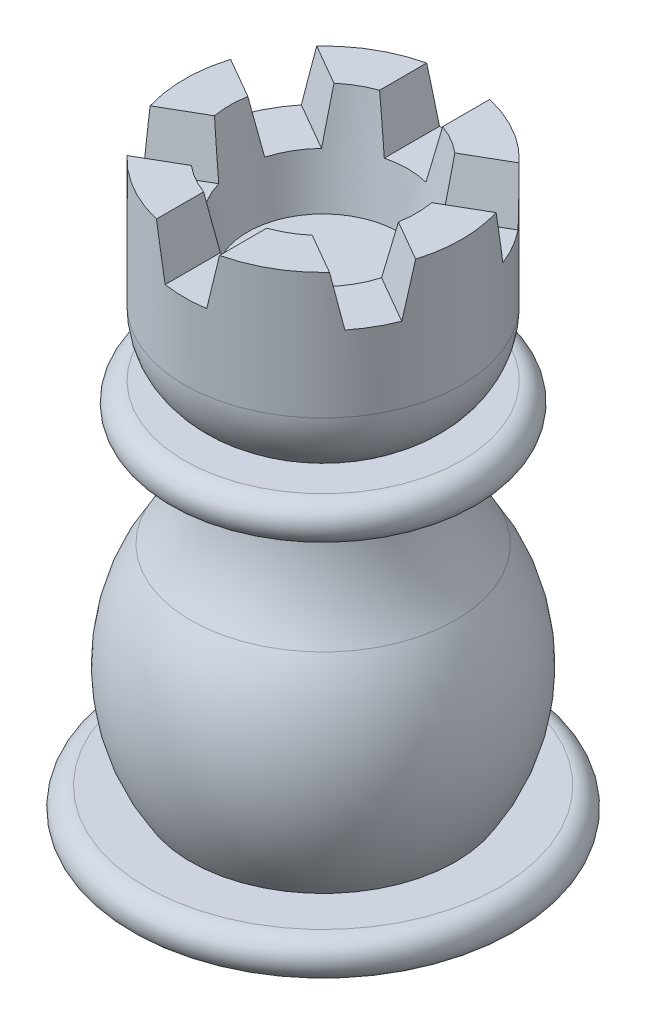
ISO-10303-21;
HEADER;
FILE_DESCRIPTION(('STEP AP214'),'2;1');
FILE_NAME('part.step','',(''),(''),'','','');
FILE_SCHEMA(('AUTOMOTIVE_DESIGN { 1 0 10303 214 1 1 1 1 }'));
ENDSEC;
DATA;
#1=APPLICATION_CONTEXT('core data for automotive mechanical design processes');
#2=APPLICATION_PROTOCOL_DEFINITION('international standard','automotive_design',2000,#1);
#3=PRODUCT_CONTEXT('',#1,'mechanical');
#4=PRODUCT('Part','Part','',(#3));
#5=PRODUCT_RELATED_PRODUCT_CATEGORY('part','',(#4));
#6=PRODUCT_DEFINITION_FORMATION('','',#4);
#7=PRODUCT_DEFINITION_CONTEXT('part definition',#1,'design');
#8=PRODUCT_DEFINITION('design','',#6,#7);
#9=PRODUCT_DEFINITION_SHAPE('','',#8);
#10=(LENGTH_UNIT() NAMED_UNIT(*) SI_UNIT(.MILLI.,.METRE.));
#11=(NAMED_UNIT(*) PLANE_ANGLE_UNIT() SI_UNIT($,.RADIAN.));
#12=(NAMED_UNIT(*) SI_UNIT($,.STERADIAN.) SOLID_ANGLE_UNIT());
#13=UNCERTAINTY_MEASURE_WITH_UNIT(LENGTH_MEASURE(1.E-05),#10,'distance_accuracy_value','');
#14=(GEOMETRIC_REPRESENTATION_CONTEXT(3) GLOBAL_UNCERTAINTY_ASSIGNED_CONTEXT((#13)) GLOBAL_UNIT_ASSIGNED_CONTEXT((#10,
#11,#12)) REPRESENTATION_CONTEXT('',''));
#15=CARTESIAN_POINT('',(0.,0.,0.));
#16=DIRECTION('',(0.,0.,1.));
#17=DIRECTION('',(1.,0.,0.));
#18=AXIS2_PLACEMENT_3D('',#15,#16,#17);
#19=CARTESIAN_POINT('',(0.,0.,0.));
#20=DIRECTION('',(0.,-1.,0.));
#21=DIRECTION('',(1.,0.,0.));
#22=AXIS2_PLACEMENT_3D('',#19,#20,#21);
#23=CYLINDRICAL_SURFACE('',#22,11.0000000000001);
#24=CARTESIAN_POINT('',(-1.23488963959887E-13,36.,0.));
#25=DIRECTION('',(0.,-1.,0.));
#26=DIRECTION('',(1.,0.,0.));
#27=AXIS2_PLACEMENT_3D('',#24,#25,#26);
#28=CIRCLE('',#27,11.0000000000001);
#29=CARTESIAN_POINT('',(11.,36.,0.));
#30=VERTEX_POINT('',#29);
#31=EDGE_CURVE('E248',#30,#30,#28,.T.);
#32=ORIENTED_EDGE('',*,*,#31,.F.);
#33=EDGE_LOOP('',(#32));
#34=FACE_BOUND('',#33,.T.);
#35=CARTESIAN_POINT('',(-1.44070457953202E-13,42.,0.));
#36=DIRECTION('',(0.,1.,0.));
#37=DIRECTION('',(-1.,0.,0.));
#38=AXIS2_PLACEMENT_3D('',#35,#36,#37);
#39=CIRCLE('',#38,11.0000000000001);
#40=CARTESIAN_POINT('',(8.59364193213736,42.,-6.86653612400103));
#41=VERTEX_POINT('',#40);
#42=CARTESIAN_POINT('',(10.2434156854572,42.,-4.00904416225737));
#43=VERTEX_POINT('',#42);
#44=EDGE_CURVE('E518',#41,#43,#39,.F.);
#45=ORIENTED_EDGE('',*,*,#44,.T.);
#46=CARTESIAN_POINT('',(-1.17446322140828E-13,34.2384247263033,0.));
#47=DIRECTION('',(-0.489073800366901,0.207911690817761,-0.847100670886274));
#48=DIRECTION('',(-0.103955845408878,-0.978147600733805,-0.180056805991959));
#49=AXIS2_PLACEMENT_3D('',#46,#47,#48);
#50=ELLIPSE('',#49,52.9070777921852,11.0000000000001);
#51=CARTESIAN_POINT('',(10.5269876576398,46.,-3.19100781194594));
#52=VERTEX_POINT('',#51);
#53=EDGE_CURVE('E443',#43,#52,#50,.F.);
#54=ORIENTED_EDGE('',*,*,#53,.T.);
#55=CARTESIAN_POINT('',(-1.57791453948745E-13,46.,0.));
#56=DIRECTION('',(0.,-1.,0.));
#57=DIRECTION('',(1.,0.,0.));
#58=AXIS2_PLACEMENT_3D('',#55,#56,#57);
#59=CIRCLE('',#58,11.0000000000002);
#60=CARTESIAN_POINT('',(10.5269876576396,46.,3.19100781194637));
#61=VERTEX_POINT('',#60);
#62=EDGE_CURVE('E249',#52,#61,#59,.T.);
#63=ORIENTED_EDGE('',*,*,#62,.T.);
#64=CARTESIAN_POINT('',(-1.17446322140833E-13,34.238424726305,0.));
#65=DIRECTION('',(0.489073800366907,-0.207911690817761,-0.847100670886271));
#66=DIRECTION('',(-0.103955845408879,-0.978147600733805,0.180056805991958));
#67=AXIS2_PLACEMENT_3D('',#64,#65,#66);
#68=ELLIPSE('',#67,52.9070777921852,11.0000000000001);
#69=CARTESIAN_POINT('',(10.243415685457,42.,4.00904416225778));
#70=VERTEX_POINT('',#69);
#71=EDGE_CURVE('E433',#70,#61,#68,.F.);
#72=ORIENTED_EDGE('',*,*,#71,.F.);
#73=CARTESIAN_POINT('',(8.59364193213709,42.,6.86653612400137));
#74=VERTEX_POINT('',#73);
#75=EDGE_CURVE('E515',#70,#74,#39,.F.);
#76=ORIENTED_EDGE('',*,*,#75,.T.);
#77=CARTESIAN_POINT('',(-1.17446322140828E-13,34.2384247263033,0.));
#78=DIRECTION('',(0.489073800366906,0.207911690817765,-0.847100670886271));
#79=DIRECTION('',(0.103955845408886,-0.978147600733805,-0.180056805991958));
#80=AXIS2_PLACEMENT_3D('',#77,#78,#79);
#81=ELLIPSE('',#80,52.9070777921851,11.0000000000001);
#82=CARTESIAN_POINT('',(8.02698765763957,46.,7.52113483086847));
#83=VERTEX_POINT('',#82);
#84=EDGE_CURVE('E429',#74,#83,#81,.F.);
#85=ORIENTED_EDGE('',*,*,#84,.T.);
#86=CARTESIAN_POINT('',(2.49999999999964,46.,10.7121426428145));
#87=VERTEX_POINT('',#86);
#88=EDGE_CURVE('E241',#83,#87,#59,.T.);
#89=ORIENTED_EDGE('',*,*,#88,.T.);
#90=CARTESIAN_POINT('',(-1.17446322140833E-13,34.238424726305,0.));
#91=DIRECTION('',(0.978147600733806,-0.207911690817759,0.));
#92=DIRECTION('',(-0.20791169081776,-0.978147600733806,0.));
#93=AXIS2_PLACEMENT_3D('',#90,#91,#92);
#94=ELLIPSE('',#93,52.9070777921852,11.0000000000001);
#95=CARTESIAN_POINT('',(1.64977375331955,42.,10.8755802862588));
#96=VERTEX_POINT('',#95);
#97=EDGE_CURVE('E423',#96,#87,#94,.F.);
#98=ORIENTED_EDGE('',*,*,#97,.F.);
#99=CARTESIAN_POINT('',(-1.6497737533202,42.,10.8755802862587));
#100=VERTEX_POINT('',#99);
#101=EDGE_CURVE('E441',#96,#100,#39,.F.);
#102=ORIENTED_EDGE('',*,*,#101,.T.);
#103=CARTESIAN_POINT('',(-1.17446322140828E-13,34.2384247263033,0.));
#104=DIRECTION('',(0.978147600733804,0.207911690817766,0.));
#105=DIRECTION('',(0.207911690817766,-0.978147600733804,0.));
#106=AXIS2_PLACEMENT_3D('',#103,#104,#105);
#107=ELLIPSE('',#106,52.9070777921852,11.0000000000001);
#108=CARTESIAN_POINT('',(-2.50000000000032,46.,10.7121426428144));
#109=VERTEX_POINT('',#108);
#110=EDGE_CURVE('E419',#100,#109,#107,.F.);
#111=ORIENTED_EDGE('',*,*,#110,.T.);
#112=CARTESIAN_POINT('',(-8.02698765764024,46.,7.52113483086809));
#113=VERTEX_POINT('',#112);
#114=EDGE_CURVE('E235',#109,#113,#59,.T.);
#115=ORIENTED_EDGE('',*,*,#114,.T.);
#116=CARTESIAN_POINT('',(-1.17446322140834E-13,34.238424726305,0.));
#117=DIRECTION('',(0.489073800366895,-0.207911690817761,0.847100670886278));
#118=DIRECTION('',(-0.103955845408876,-0.978147600733805,-0.180056805991959));
#119=AXIS2_PLACEMENT_3D('',#116,#117,#118);
#120=ELLIPSE('',#119,52.9070777921852,11.0000000000001);
#121=CARTESIAN_POINT('',(-8.5936419321377,42.,6.86653612400096));
#122=VERTEX_POINT('',#121);
#123=EDGE_CURVE('E416',#122,#113,#120,.F.);
#124=ORIENTED_EDGE('',*,*,#123,.F.);
#125=CARTESIAN_POINT('',(-10.2434156854575,42.,4.0090441622573));
#126=VERTEX_POINT('',#125);
#127=EDGE_CURVE('E360',#122,#126,#39,.F.);
#128=ORIENTED_EDGE('',*,*,#127,.T.);
#129=CARTESIAN_POINT('',(-1.17446322140828E-13,34.2384247263033,0.));
#130=DIRECTION('',(0.489073800366894,0.207911690817765,0.847100670886278));
#131=DIRECTION('',(0.103955845408883,-0.978147600733804,0.18005680599196));
#132=AXIS2_PLACEMENT_3D('',#129,#130,#131);
#133=ELLIPSE('',#132,52.9070777921852,11.0000000000001);
#134=CARTESIAN_POINT('',(-10.5269876576401,46.,3.19100781194587));
#135=VERTEX_POINT('',#134);
#136=EDGE_CURVE('E218',#126,#135,#133,.F.);
#137=ORIENTED_EDGE('',*,*,#136,.T.);
#138=CARTESIAN_POINT('',(-10.5269876576399,46.,-3.19100781194644));
#139=VERTEX_POINT('',#138);
#140=EDGE_CURVE('E226',#135,#139,#59,.T.);
#141=ORIENTED_EDGE('',*,*,#140,.T.);
#142=CARTESIAN_POINT('',(-1.17446322140833E-13,34.238424726305,0.));
#143=DIRECTION('',(-0.489073800366912,-0.207911690817765,0.847100670886268));
#144=DIRECTION('',(0.103955845408887,-0.978147600733805,-0.180056805991957));
#145=AXIS2_PLACEMENT_3D('',#142,#143,#144);
#146=ELLIPSE('',#145,52.9070777921852,11.0000000000001);
#147=CARTESIAN_POINT('',(-10.2434156854573,42.,-4.00904416225785));
#148=VERTEX_POINT('',#147);
#149=EDGE_CURVE('E207',#148,#139,#146,.F.);
#150=ORIENTED_EDGE('',*,*,#149,.F.);
#151=CARTESIAN_POINT('',(-8.5936419321376,42.,-6.86653612400108));
#152=VERTEX_POINT('',#151);
#153=EDGE_CURVE('E442',#148,#152,#39,.F.);
#154=ORIENTED_EDGE('',*,*,#153,.T.);
#155=CARTESIAN_POINT('',(-1.17446322140833E-13,34.238424726305,0.));
#156=DIRECTION('',(0.489073800366907,-0.207911690817761,-0.847100670886271));
#157=DIRECTION('',(-0.103955845408879,-0.978147600733805,0.180056805991958));
#158=AXIS2_PLACEMENT_3D('',#155,#156,#157);
#159=ELLIPSE('',#158,52.9070777921852,11.0000000000001);
#160=CARTESIAN_POINT('',(-8.02698765764014,46.,-7.5211348308682));
#161=VERTEX_POINT('',#160);
#162=EDGE_CURVE('E426',#161,#152,#159,.F.);
#163=ORIENTED_EDGE('',*,*,#162,.F.);
#164=CARTESIAN_POINT('',(-2.49999999999996,46.,-10.7121426428145));
#165=VERTEX_POINT('',#164);
#166=EDGE_CURVE('E236',#161,#165,#59,.T.);
#167=ORIENTED_EDGE('',*,*,#166,.T.);
#168=CARTESIAN_POINT('',(-1.17446322140833E-13,34.238424726305,0.));
#169=DIRECTION('',(-0.978147600733804,-0.207911690817766,0.));
#170=DIRECTION('',(0.207911690817766,-0.978147600733804,0.));
#171=AXIS2_PLACEMENT_3D('',#168,#169,#170);
#172=ELLIPSE('',#171,52.9070777921852,11.0000000000001);
#173=CARTESIAN_POINT('',(-1.64977375331984,42.,-10.8755802862588));
#174=VERTEX_POINT('',#173);
#175=EDGE_CURVE('E452',#174,#165,#172,.F.);
#176=ORIENTED_EDGE('',*,*,#175,.F.);
#177=CARTESIAN_POINT('',(-1.44070457953202E-13,42.,0.));
#178=DIRECTION('',(0.,1.,0.));
#179=DIRECTION('',(-1.,0.,0.));
#180=AXIS2_PLACEMENT_3D('',#177,#178,#179);
#181=CIRCLE('',#180,11.0000000000001);
#182=CARTESIAN_POINT('',(1.64977375331991,42.,-10.8755802862587));
#183=VERTEX_POINT('',#182);
#184=EDGE_CURVE('E467',#174,#183,#181,.F.);
#185=ORIENTED_EDGE('',*,*,#184,.T.);
#186=CARTESIAN_POINT('',(-1.17446322140828E-13,34.2384247263033,0.));
#187=DIRECTION('',(-0.978147600733806,0.20791169081776,0.));
#188=DIRECTION('',(-0.20791169081776,-0.978147600733806,0.));
#189=AXIS2_PLACEMENT_3D('',#186,#187,#188);
#190=ELLIPSE('',#189,52.9070777921852,11.0000000000001);
#191=CARTESIAN_POINT('',(2.5,46.,-10.7121426428144));
#192=VERTEX_POINT('',#191);
#193=EDGE_CURVE('E471',#183,#192,#190,.F.);
#194=ORIENTED_EDGE('',*,*,#193,.T.);
#195=CARTESIAN_POINT('',(8.02698765763987,46.,-7.52113483086814));
#196=VERTEX_POINT('',#195);
#197=EDGE_CURVE('E243',#192,#196,#59,.T.);
#198=ORIENTED_EDGE('',*,*,#197,.T.);
#199=CARTESIAN_POINT('',(-1.17446322140833E-13,34.238424726305,0.));
#200=DIRECTION('',(-0.4890738003669,-0.207911690817765,-0.847100670886274));
#201=DIRECTION('',(0.103955845408884,-0.978147600733805,0.180056805991959));
#202=AXIS2_PLACEMENT_3D('',#199,#200,#201);
#203=ELLIPSE('',#202,52.9070777921852,11.0000000000001);
#204=EDGE_CURVE('E436',#41,#196,#203,.F.);
#205=ORIENTED_EDGE('',*,*,#204,.F.);
#206=EDGE_LOOP('',(#45,#54,#63,#72,#76,#85,#89,#98,#102,#111,#115,#124,#128,#137,#141,#150,#154,
#163,#167,#176,#185,#194,#198,#205));
#207=FACE_BOUND('',#206,.T.);
#208=ADVANCED_FACE('F45',(#34,#207),#23,.T.);
#209=CARTESIAN_POINT('',(11.,46.,0.));
#210=DIRECTION('',(0.,1.,0.));
#211=DIRECTION('',(-1.,0.,0.));
#212=AXIS2_PLACEMENT_3D('',#209,#210,#211);
#213=PLANE('',#212);
#214=ORIENTED_EDGE('',*,*,#62,.F.);
#215=DIRECTION('',(-0.86602540378444,0.,0.499999999999998));
#216=VECTOR('',#215,1.);
#217=CARTESIAN_POINT('',(19.5866968793295,46.0000000000001,-8.42163336986818));
#218=LINE('',#217,#216);
#219=CARTESIAN_POINT('',(7.29155777999725,46.,-1.32303150114488));
#220=VERTEX_POINT('',#219);
#221=EDGE_CURVE('E219',#52,#220,#218,.T.);
#222=ORIENTED_EDGE('',*,*,#221,.T.);
#223=CARTESIAN_POINT('',(-1.57791453948745E-13,46.,0.));
#224=DIRECTION('',(0.,-1.,0.));
#225=DIRECTION('',(1.,0.,0.));
#226=AXIS2_PLACEMENT_3D('',#223,#224,#225);
#227=CIRCLE('',#226,7.41061584566782);
#228=CARTESIAN_POINT('',(7.29155777999726,46.,1.32303150114536));
#229=VERTEX_POINT('',#228);
#230=EDGE_CURVE('E489',#220,#229,#227,.T.);
#231=ORIENTED_EDGE('',*,*,#230,.T.);
#232=DIRECTION('',(-0.866025403784436,0.,-0.500000000000004));
#233=VECTOR('',#232,1.);
#234=CARTESIAN_POINT('',(19.5866968793292,46.0000000000001,8.42163336986865));
#235=LINE('',#234,#233);
#236=EDGE_CURVE('E399',#61,#229,#235,.T.);
#237=ORIENTED_EDGE('',*,*,#236,.F.);
#238=EDGE_LOOP('',(#214,#222,#231,#237));
#239=FACE_BOUND('',#238,.T.);
#240=ADVANCED_FACE('F569',(#239),#213,.T.);
#241=ORIENTED_EDGE('',*,*,#88,.F.);
#242=DIRECTION('',(-0.866025403784436,0.,-0.500000000000004));
#243=VECTOR('',#242,1.);
#244=CARTESIAN_POINT('',(17.0866968793292,46.,12.7517603887908));
#245=LINE('',#244,#243);
#246=CARTESIAN_POINT('',(4.79155777999712,46.,5.65315852006743));
#247=VERTEX_POINT('',#246);
#248=EDGE_CURVE('E387',#83,#247,#245,.T.);
#249=ORIENTED_EDGE('',*,*,#248,.T.);
#250=CARTESIAN_POINT('',(2.49999999999964,46.,6.97619002121243));
#251=VERTEX_POINT('',#250);
#252=EDGE_CURVE('E495',#247,#251,#227,.T.);
#253=ORIENTED_EDGE('',*,*,#252,.T.);
#254=DIRECTION('',(0.,0.,-1.));
#255=VECTOR('',#254,1.);
#256=CARTESIAN_POINT('',(2.49999999999964,46.,15.5));
#257=LINE('',#256,#255);
#258=EDGE_CURVE('E384',#87,#251,#257,.T.);
#259=ORIENTED_EDGE('',*,*,#258,.F.);
#260=EDGE_LOOP('',(#241,#249,#253,#259));
#261=FACE_BOUND('',#260,.T.);
#262=ADVANCED_FACE('F564',(#261),#213,.T.);
#263=ORIENTED_EDGE('',*,*,#114,.F.);
#264=DIRECTION('',(0.,0.,-1.));
#265=VECTOR('',#264,1.);
#266=CARTESIAN_POINT('',(-2.50000000000032,46.,15.5));
#267=LINE('',#266,#265);
#268=CARTESIAN_POINT('',(-2.50000000000032,46.,6.97619002121228));
#269=VERTEX_POINT('',#268);
#270=EDGE_CURVE('E373',#109,#269,#267,.T.);
#271=ORIENTED_EDGE('',*,*,#270,.T.);
#272=CARTESIAN_POINT('',(-4.79155777999773,46.,5.65315852006706));
#273=VERTEX_POINT('',#272);
#274=EDGE_CURVE('E486',#269,#273,#227,.T.);
#275=ORIENTED_EDGE('',*,*,#274,.T.);
#276=DIRECTION('',(0.866025403784443,0.,-0.499999999999992));
#277=VECTOR('',#276,1.);
#278=CARTESIAN_POINT('',(-17.0866968793297,45.9999999999999,12.7517603887901));
#279=LINE('',#278,#277);
#280=EDGE_CURVE('E364',#113,#273,#279,.T.);
#281=ORIENTED_EDGE('',*,*,#280,.F.);
#282=EDGE_LOOP('',(#263,#271,#275,#281));
#283=FACE_BOUND('',#282,.T.);
#284=ADVANCED_FACE('F507',(#283),#213,.T.);
#285=ORIENTED_EDGE('',*,*,#140,.F.);
#286=DIRECTION('',(0.866025403784443,0.,-0.499999999999992));
#287=VECTOR('',#286,1.);
#288=CARTESIAN_POINT('',(-19.5866968793297,45.9999999999999,8.42163336986796));
#289=LINE('',#288,#287);
#290=CARTESIAN_POINT('',(-7.29155777999758,46.,1.32303150114484));
#291=VERTEX_POINT('',#290);
#292=EDGE_CURVE('E368',#135,#291,#289,.T.);
#293=ORIENTED_EDGE('',*,*,#292,.T.);
#294=CARTESIAN_POINT('',(-7.29155777999751,45.9999999999999,-1.32303150114539));
#295=VERTEX_POINT('',#294);
#296=EDGE_CURVE('E228',#291,#295,#227,.T.);
#297=ORIENTED_EDGE('',*,*,#296,.T.);
#298=DIRECTION('',(0.866025403784433,0.,0.50000000000001));
#299=VECTOR('',#298,1.);
#300=CARTESIAN_POINT('',(-19.5866968793294,45.9999999999999,-8.42163336986875));
#301=LINE('',#300,#299);
#302=EDGE_CURVE('E210',#139,#295,#301,.T.);
#303=ORIENTED_EDGE('',*,*,#302,.F.);
#304=EDGE_LOOP('',(#285,#293,#297,#303));
#305=FACE_BOUND('',#304,.T.);
#306=ADVANCED_FACE('F224',(#305),#213,.T.);
#307=CARTESIAN_POINT('',(-4.79155777999776,46.,-5.65315852006719));
#308=VERTEX_POINT('',#307);
#309=EDGE_CURVE('E377',#308,#161,#235,.T.);
#310=ORIENTED_EDGE('',*,*,#309,.F.);
#311=CARTESIAN_POINT('',(-2.49999999999995,46.,-6.97619002121247));
#312=VERTEX_POINT('',#311);
#313=EDGE_CURVE('E477',#308,#312,#227,.T.);
#314=ORIENTED_EDGE('',*,*,#313,.T.);
#315=DIRECTION('',(0.,0.,1.));
#316=VECTOR('',#315,1.);
#317=CARTESIAN_POINT('',(-2.49999999999996,46.,-15.5));
#318=LINE('',#317,#316);
#319=EDGE_CURVE('E447',#165,#312,#318,.T.);
#320=ORIENTED_EDGE('',*,*,#319,.F.);
#321=ORIENTED_EDGE('',*,*,#166,.F.);
#322=EDGE_LOOP('',(#310,#314,#320,#321));
#323=FACE_BOUND('',#322,.T.);
#324=ADVANCED_FACE('F539',(#323),#213,.T.);
#325=CARTESIAN_POINT('',(-1.57791453948745E-13,46.,0.));
#326=DIRECTION('',(0.,1.,0.));
#327=DIRECTION('',(-1.,0.,0.));
#328=AXIS2_PLACEMENT_3D('',#325,#326,#327);
#329=CONICAL_SURFACE('',#328,7.41061584566782,0.17453292519943);
#330=CARTESIAN_POINT('',(-1.30349461957659E-13,38.,0.));
#331=DIRECTION('',(0.,-1.,0.));
#332=DIRECTION('',(1.,0.,0.));
#333=AXIS2_PLACEMENT_3D('',#330,#331,#332);
#334=CIRCLE('',#333,6.00000000000013);
#335=CARTESIAN_POINT('',(6.,38.,0.));
#336=VERTEX_POINT('',#335);
#337=EDGE_CURVE('E474',#336,#336,#334,.T.);
#338=ORIENTED_EDGE('',*,*,#337,.T.);
#339=EDGE_LOOP('',(#338));
#340=FACE_BOUND('',#339,.T.);
#341=ORIENTED_EDGE('',*,*,#230,.F.);
#342=CARTESIAN_POINT('',(7.09832491764619,101.028410995145,12.294659405996));
#343=DIRECTION('',(-0.489073800366901,0.207911690817761,-0.847100670886274));
#344=DIRECTION('',(0.103955845408878,0.978147600733805,0.180056805991959));
#345=AXIS2_PLACEMENT_3D('',#342,#343,#344);
#346=ELLIPSE('',#345,82.3119149400124,9.55671284905581);
#347=CARTESIAN_POINT('',(6.4533458733265,42.,-1.82084633597626));
#348=VERTEX_POINT('',#347);
#349=EDGE_CURVE('E11',#220,#348,#346,.T.);
#350=ORIENTED_EDGE('',*,*,#349,.T.);
#351=CARTESIAN_POINT('',(-1.40333302226767E-13,42.,0.));
#352=DIRECTION('',(0.,1.,0.));
#353=DIRECTION('',(-1.,0.,0.));
#354=AXIS2_PLACEMENT_3D('',#351,#352,#353);
#355=CIRCLE('',#354,6.70530792283398);
#356=CARTESIAN_POINT('',(4.80357212000662,42.,-4.67833829771988));
#357=VERTEX_POINT('',#356);
#358=EDGE_CURVE('E54',#348,#357,#355,.T.);
#359=ORIENTED_EDGE('',*,*,#358,.T.);
#360=CARTESIAN_POINT('',(-7.09832491764723,101.028410995149,-12.2946594059966));
#361=DIRECTION('',(-0.4890738003669,-0.207911690817765,-0.847100670886274));
#362=DIRECTION('',(-0.103955845408884,0.978147600733804,-0.180056805991959));
#363=AXIS2_PLACEMENT_3D('',#360,#361,#362);
#364=ELLIPSE('',#363,82.3119149400162,9.55671284905629);
#365=CARTESIAN_POINT('',(4.79155777999739,46.,-5.65315852006711));
#366=VERTEX_POINT('',#365);
#367=EDGE_CURVE('E330',#366,#357,#364,.T.);
#368=ORIENTED_EDGE('',*,*,#367,.F.);
#369=CARTESIAN_POINT('',(2.5,46.,-6.97619002121233));
#370=VERTEX_POINT('',#369);
#371=EDGE_CURVE('E242',#370,#366,#227,.T.);
#372=ORIENTED_EDGE('',*,*,#371,.F.);
#373=CARTESIAN_POINT('',(14.196649835293,101.028410995146,0.));
#374=DIRECTION('',(-0.978147600733806,0.20791169081776,0.));
#375=DIRECTION('',(0.20791169081776,0.978147600733805,0.));
#376=AXIS2_PLACEMENT_3D('',#373,#374,#375);
#377=ELLIPSE('',#376,82.3119149400139,9.5567128490559);
#378=CARTESIAN_POINT('',(1.64977375331991,42.,-6.49918463369647));
#379=VERTEX_POINT('',#378);
#380=EDGE_CURVE('E293',#370,#379,#377,.T.);
#381=ORIENTED_EDGE('',*,*,#380,.T.);
#382=CARTESIAN_POINT('',(-1.38781866297303E-13,42.,0.));
#383=DIRECTION('',(0.,1.,0.));
#384=DIRECTION('',(-1.,0.,0.));
#385=AXIS2_PLACEMENT_3D('',#382,#383,#384);
#386=CIRCLE('',#385,6.70530792283398);
#387=CARTESIAN_POINT('',(-1.64977375331984,42.,-6.49918463369662));
#388=VERTEX_POINT('',#387);
#389=EDGE_CURVE('E289',#379,#388,#386,.T.);
#390=ORIENTED_EDGE('',*,*,#389,.T.);
#391=CARTESIAN_POINT('',(-14.1966498352947,101.028410995152,0.));
#392=DIRECTION('',(-0.978147600733804,-0.207911690817766,0.));
#393=DIRECTION('',(-0.207911690817766,0.978147600733804,0.));
#394=AXIS2_PLACEMENT_3D('',#391,#392,#393);
#395=ELLIPSE('',#394,82.3119149400197,9.55671284905649);
#396=EDGE_CURVE('E286',#312,#388,#395,.T.);
#397=ORIENTED_EDGE('',*,*,#396,.F.);
#398=ORIENTED_EDGE('',*,*,#313,.F.);
#399=CARTESIAN_POINT('',(7.09832491764688,101.028410995152,-12.294659405997));
#400=DIRECTION('',(0.489073800366907,-0.207911690817761,-0.847100670886271));
#401=DIRECTION('',(0.103955845408879,0.978147600733805,-0.180056805991958));
#402=AXIS2_PLACEMENT_3D('',#399,#400,#401);
#403=ELLIPSE('',#402,82.3119149400197,9.5567128490565);
#404=CARTESIAN_POINT('',(-4.80357212000701,42.,-4.67833829771999));
#405=VERTEX_POINT('',#404);
#406=EDGE_CURVE('E304',#405,#308,#403,.T.);
#407=ORIENTED_EDGE('',*,*,#406,.F.);
#408=CARTESIAN_POINT('',(-6.45334587332666,42.,-1.8208463359767));
#409=VERTEX_POINT('',#408);
#410=EDGE_CURVE('E300',#405,#409,#355,.T.);
#411=ORIENTED_EDGE('',*,*,#410,.T.);
#412=CARTESIAN_POINT('',(-7.09832491764756,101.028410995151,12.2946594059968));
#413=DIRECTION('',(-0.489073800366912,-0.207911690817765,0.847100670886268));
#414=DIRECTION('',(-0.103955845408887,0.978147600733805,0.180056805991957));
#415=AXIS2_PLACEMENT_3D('',#412,#413,#414);
#416=ELLIPSE('',#415,82.3119149400183,9.55671284905642);
#417=EDGE_CURVE('E297',#295,#409,#416,.T.);
#418=ORIENTED_EDGE('',*,*,#417,.F.);
#419=ORIENTED_EDGE('',*,*,#296,.F.);
#420=CARTESIAN_POINT('',(-7.0983249176468,101.028410995145,-12.2946594059961));
#421=DIRECTION('',(0.489073800366894,0.207911690817765,0.847100670886278));
#422=DIRECTION('',(-0.103955845408883,0.978147600733804,-0.18005680599196));
#423=AXIS2_PLACEMENT_3D('',#420,#421,#422);
#424=ELLIPSE('',#423,82.3119149400125,9.55671284905582);
#425=CARTESIAN_POINT('',(-6.45334587332676,42.,1.82084633597619));
#426=VERTEX_POINT('',#425);
#427=EDGE_CURVE('E308',#291,#426,#424,.T.);
#428=ORIENTED_EDGE('',*,*,#427,.T.);
#429=CARTESIAN_POINT('',(-4.80357212000696,42.,4.67833829771986));
#430=VERTEX_POINT('',#429);
#431=EDGE_CURVE('E305',#426,#430,#355,.T.);
#432=ORIENTED_EDGE('',*,*,#431,.T.);
#433=CARTESIAN_POINT('',(7.09832491764651,101.02841099515,12.2946594059968));
#434=DIRECTION('',(0.489073800366895,-0.207911690817761,0.847100670886278));
#435=DIRECTION('',(0.103955845408876,0.978147600733805,0.180056805991959));
#436=AXIS2_PLACEMENT_3D('',#433,#434,#435);
#437=ELLIPSE('',#436,82.3119149400169,9.55671284905633);
#438=EDGE_CURVE('E312',#273,#430,#437,.T.);
#439=ORIENTED_EDGE('',*,*,#438,.F.);
#440=ORIENTED_EDGE('',*,*,#274,.F.);
#441=CARTESIAN_POINT('',(-14.1966498352935,101.028410995144,0.));
#442=DIRECTION('',(0.978147600733804,0.207911690817766,0.));
#443=DIRECTION('',(-0.207911690817766,0.978147600733804,0.));
#444=AXIS2_PLACEMENT_3D('',#441,#442,#443);
#445=ELLIPSE('',#444,82.3119149400124,9.55671284905581);
#446=CARTESIAN_POINT('',(-1.6497737533202,42.,6.49918463369644));
#447=VERTEX_POINT('',#446);
#448=EDGE_CURVE('E315',#269,#447,#445,.T.);
#449=ORIENTED_EDGE('',*,*,#448,.T.);
#450=CARTESIAN_POINT('',(1.64977375331955,42.,6.49918463369656));
#451=VERTEX_POINT('',#450);
#452=EDGE_CURVE('E319',#447,#451,#355,.T.);
#453=ORIENTED_EDGE('',*,*,#452,.T.);
#454=CARTESIAN_POINT('',(14.1966498352938,101.028410995151,0.));
#455=DIRECTION('',(0.978147600733806,-0.207911690817759,0.));
#456=DIRECTION('',(0.207911690817759,0.978147600733805,0.));
#457=AXIS2_PLACEMENT_3D('',#454,#455,#456);
#458=ELLIPSE('',#457,82.3119149400183,9.55671284905641);
#459=EDGE_CURVE('E320',#251,#451,#458,.T.);
#460=ORIENTED_EDGE('',*,*,#459,.F.);
#461=ORIENTED_EDGE('',*,*,#252,.F.);
#462=CARTESIAN_POINT('',(-7.09832491764706,101.028410995145,12.2946594059962));
#463=DIRECTION('',(0.489073800366906,0.207911690817765,-0.847100670886271));
#464=DIRECTION('',(-0.103955845408886,0.978147600733804,0.180056805991958));
#465=AXIS2_PLACEMENT_3D('',#462,#463,#464);
#466=ELLIPSE('',#465,82.3119149400138,9.55671284905589);
#467=CARTESIAN_POINT('',(4.80357212000644,42.,4.67833829772024));
#468=VERTEX_POINT('',#467);
#469=EDGE_CURVE('E323',#247,#468,#466,.T.);
#470=ORIENTED_EDGE('',*,*,#469,.T.);
#471=CARTESIAN_POINT('',(6.45334587332644,42.,1.82084633597669));
#472=VERTEX_POINT('',#471);
#473=EDGE_CURVE('E327',#468,#472,#355,.T.);
#474=ORIENTED_EDGE('',*,*,#473,.T.);
#475=CARTESIAN_POINT('',(7.09832491764688,101.028410995152,-12.294659405997));
#476=DIRECTION('',(0.489073800366907,-0.207911690817761,-0.847100670886271));
#477=DIRECTION('',(0.103955845408879,0.978147600733805,-0.180056805991958));
#478=AXIS2_PLACEMENT_3D('',#475,#476,#477);
#479=ELLIPSE('',#478,82.3119149400197,9.5567128490565);
#480=EDGE_CURVE('E328',#229,#472,#479,.T.);
#481=ORIENTED_EDGE('',*,*,#480,.F.);
#482=EDGE_LOOP('',(#341,#350,#359,#368,#372,#381,#390,#397,#398,#407,#411,#418,#419,#428,#432,
#439,#440,#449,#453,#460,#461,#470,#474,#481));
#483=FACE_BOUND('',#482,.T.);
#484=ADVANCED_FACE('F350',(#340,#483),#329,.F.);
#485=DIRECTION('',(-0.86602540378444,0.,0.499999999999998));
#486=VECTOR('',#485,1.);
#487=CARTESIAN_POINT('',(17.0866968793295,46.0000000000001,-12.7517603887903));
#488=LINE('',#487,#486);
#489=EDGE_CURVE('E391',#196,#366,#488,.T.);
#490=ORIENTED_EDGE('',*,*,#489,.F.);
#491=ORIENTED_EDGE('',*,*,#197,.F.);
#492=DIRECTION('',(0.,0.,1.));
#493=VECTOR('',#492,1.);
#494=CARTESIAN_POINT('',(2.5,46.,-15.5));
#495=LINE('',#494,#493);
#496=EDGE_CURVE('E448',#192,#370,#495,.T.);
#497=ORIENTED_EDGE('',*,*,#496,.T.);
#498=ORIENTED_EDGE('',*,*,#371,.T.);
#499=EDGE_LOOP('',(#490,#491,#497,#498));
#500=FACE_BOUND('',#499,.T.);
#501=ADVANCED_FACE('F550',(#500),#213,.T.);
#502=CARTESIAN_POINT('',(0.,0.,0.));
#503=DIRECTION('',(0.,-1.,0.));
#504=DIRECTION('',(1.,0.,0.));
#505=AXIS2_PLACEMENT_3D('',#502,#503,#504);
#506=PLANE('',#505);
#507=CARTESIAN_POINT('',(0.,0.,0.));
#508=DIRECTION('',(0.,-1.,0.));
#509=DIRECTION('',(1.,0.,0.));
#510=AXIS2_PLACEMENT_3D('',#507,#508,#509);
#511=CIRCLE('',#510,14.);
#512=CARTESIAN_POINT('',(14.,0.,0.));
#513=VERTEX_POINT('',#512);
#514=EDGE_CURVE('E282',#513,#513,#511,.T.);
#515=ORIENTED_EDGE('',*,*,#514,.T.);
#516=EDGE_LOOP('',(#515));
#517=FACE_BOUND('',#516,.T.);
#518=ADVANCED_FACE('F47',(#517),#506,.T.);
#519=CARTESIAN_POINT('',(0.,1.49999999999995,0.));
#520=DIRECTION('',(0.,-1.,0.));
#521=DIRECTION('',(1.,0.,0.));
#522=AXIS2_PLACEMENT_3D('',#519,#520,#521);
#523=TOROIDAL_SURFACE('',#522,14.,1.5);
#524=CARTESIAN_POINT('',(0.,2.99999999999995,0.));
#525=DIRECTION('',(0.,-1.,0.));
#526=DIRECTION('',(1.,0.,0.));
#527=AXIS2_PLACEMENT_3D('',#524,#525,#526);
#528=CIRCLE('',#527,14.);
#529=CARTESIAN_POINT('',(14.,3.,0.));
#530=VERTEX_POINT('',#529);
#531=EDGE_CURVE('E278',#530,#530,#528,.T.);
#532=ORIENTED_EDGE('',*,*,#531,.T.);
#533=EDGE_LOOP('',(#532));
#534=FACE_BOUND('',#533,.T.);
#535=ORIENTED_EDGE('',*,*,#514,.F.);
#536=EDGE_LOOP('',(#535));
#537=FACE_BOUND('',#536,.T.);
#538=ADVANCED_FACE('F585',(#534,#537),#523,.T.);
#539=CARTESIAN_POINT('',(14.,3.00000000000001,0.));
#540=DIRECTION('',(0.,1.,0.));
#541=DIRECTION('',(-1.,0.,0.));
#542=AXIS2_PLACEMENT_3D('',#539,#540,#541);
#543=PLANE('',#542);
#544=CARTESIAN_POINT('',(0.,2.99999999999996,0.));
#545=DIRECTION('',(0.,-1.,0.));
#546=DIRECTION('',(1.,0.,0.));
#547=AXIS2_PLACEMENT_3D('',#544,#545,#546);
#548=CIRCLE('',#547,10.5);
#549=CARTESIAN_POINT('',(10.5,3.,0.));
#550=VERTEX_POINT('',#549);
#551=EDGE_CURVE('E274',#550,#550,#548,.T.);
#552=ORIENTED_EDGE('',*,*,#551,.T.);
#553=EDGE_LOOP('',(#552));
#554=FACE_BOUND('',#553,.T.);
#555=ORIENTED_EDGE('',*,*,#531,.F.);
#556=EDGE_LOOP('',(#555));
#557=FACE_BOUND('',#556,.T.);
#558=ADVANCED_FACE('F839',(#554,#557),#543,.T.);
#559=CARTESIAN_POINT('',(0.,11.2915619758885,0.));
#560=DIRECTION('',(0.,-1.,0.));
#561=DIRECTION('',(1.,0.,0.));
#562=AXIS2_PLACEMENT_3D('',#559,#560,#561);
#563=DEGENERATE_TOROIDAL_SURFACE('',#562,1.99999999999996,15.,.F.);
#564=CARTESIAN_POINT('',(0.,19.5832509406104,0.));
#565=DIRECTION('',(0.,-1.,0.));
#566=DIRECTION('',(1.,0.,0.));
#567=AXIS2_PLACEMENT_3D('',#564,#565,#566);
#568=CIRCLE('',#567,10.4999157642086);
#569=CARTESIAN_POINT('',(10.4999157642085,19.5832509406104,0.));
#570=VERTEX_POINT('',#569);
#571=EDGE_CURVE('E270',#570,#570,#568,.T.);
#572=ORIENTED_EDGE('',*,*,#571,.T.);
#573=EDGE_LOOP('',(#572));
#574=FACE_BOUND('',#573,.T.);
#575=ORIENTED_EDGE('',*,*,#551,.F.);
#576=EDGE_LOOP('',(#575));
#577=FACE_BOUND('',#576,.T.);
#578=ADVANCED_FACE('F835',(#574,#577),#563,.F.);
#579=CARTESIAN_POINT('',(0.,27.8749399053323,0.));
#580=DIRECTION('',(0.,-1.,0.));
#581=DIRECTION('',(1.,0.,0.));
#582=AXIS2_PLACEMENT_3D('',#579,#580,#581);
#583=TOROIDAL_SURFACE('',#582,22.9998315284171,15.);
#584=CARTESIAN_POINT('',(0.,27.8038475772933,0.));
#585=DIRECTION('',(0.,-1.,0.));
#586=DIRECTION('',(1.,0.,0.));
#587=AXIS2_PLACEMENT_3D('',#584,#585,#586);
#588=CIRCLE('',#587,8.0000000000001);
#589=CARTESIAN_POINT('',(8.,27.8038475772934,0.));
#590=VERTEX_POINT('',#589);
#591=EDGE_CURVE('E266',#590,#590,#588,.T.);
#592=ORIENTED_EDGE('',*,*,#591,.T.);
#593=EDGE_LOOP('',(#592));
#594=FACE_BOUND('',#593,.T.);
#595=ORIENTED_EDGE('',*,*,#571,.F.);
#596=EDGE_LOOP('',(#595));
#597=FACE_BOUND('',#596,.T.);
#598=ADVANCED_FACE('F831',(#594,#597),#583,.F.);
#599=CARTESIAN_POINT('',(8.,27.8038475772934,0.));
#600=DIRECTION('',(0.,-1.,0.));
#601=DIRECTION('',(1.,0.,0.));
#602=AXIS2_PLACEMENT_3D('',#599,#600,#601);
#603=PLANE('',#602);
#604=CARTESIAN_POINT('',(0.,27.8038475772933,0.));
#605=DIRECTION('',(0.,-1.,0.));
#606=DIRECTION('',(1.,0.,0.));
#607=AXIS2_PLACEMENT_3D('',#604,#605,#606);
#608=CIRCLE('',#607,11.0000000000001);
#609=CARTESIAN_POINT('',(11.,27.8038475772934,0.));
#610=VERTEX_POINT('',#609);
#611=EDGE_CURVE('E262',#610,#610,#608,.T.);
#612=ORIENTED_EDGE('',*,*,#611,.T.);
#613=EDGE_LOOP('',(#612));
#614=FACE_BOUND('',#613,.T.);
#615=ORIENTED_EDGE('',*,*,#591,.F.);
#616=EDGE_LOOP('',(#615));
#617=FACE_BOUND('',#616,.T.);
#618=ADVANCED_FACE('F827',(#614,#617),#603,.T.);
#619=CARTESIAN_POINT('',(-1.00613961606655E-13,29.3038475772933,0.));
#620=DIRECTION('',(0.,-1.,0.));
#621=DIRECTION('',(1.,0.,0.));
#622=AXIS2_PLACEMENT_3D('',#619,#620,#621);
#623=TOROIDAL_SURFACE('',#622,11.0000000000001,1.5);
#624=CARTESIAN_POINT('',(-1.0566486731384E-13,30.8038475772933,0.));
#625=DIRECTION('',(0.,-1.,0.));
#626=DIRECTION('',(1.,0.,0.));
#627=AXIS2_PLACEMENT_3D('',#624,#625,#626);
#628=CIRCLE('',#627,11.0000000000001);
#629=CARTESIAN_POINT('',(11.,30.8038475772934,0.));
#630=VERTEX_POINT('',#629);
#631=EDGE_CURVE('E258',#630,#630,#628,.T.);
#632=ORIENTED_EDGE('',*,*,#631,.T.);
#633=EDGE_LOOP('',(#632));
#634=FACE_BOUND('',#633,.T.);
#635=ORIENTED_EDGE('',*,*,#611,.F.);
#636=EDGE_LOOP('',(#635));
#637=FACE_BOUND('',#636,.T.);
#638=ADVANCED_FACE('F820',(#634,#637),#623,.T.);
#639=CARTESIAN_POINT('',(11.,30.8038475772934,0.));
#640=DIRECTION('',(0.,1.,0.));
#641=DIRECTION('',(-1.,0.,0.));
#642=AXIS2_PLACEMENT_3D('',#639,#640,#641);
#643=PLANE('',#642);
#644=CARTESIAN_POINT('',(-1.0566486731384E-13,30.8038475772933,0.));
#645=DIRECTION('',(0.,-1.,0.));
#646=DIRECTION('',(1.,0.,0.));
#647=AXIS2_PLACEMENT_3D('',#644,#645,#646);
#648=CIRCLE('',#647,8.00000000000011);
#649=CARTESIAN_POINT('',(8.,30.8038475772934,0.));
#650=VERTEX_POINT('',#649);
#651=EDGE_CURVE('E254',#650,#650,#648,.T.);
#652=ORIENTED_EDGE('',*,*,#651,.T.);
#653=EDGE_LOOP('',(#652));
#654=FACE_BOUND('',#653,.T.);
#655=ORIENTED_EDGE('',*,*,#631,.F.);
#656=EDGE_LOOP('',(#655));
#657=FACE_BOUND('',#656,.T.);
#658=ADVANCED_FACE('F814',(#654,#657),#643,.T.);
#659=CARTESIAN_POINT('',(-1.23165366794353E-13,36.,0.));
#660=DIRECTION('',(0.,-1.,0.));
#661=DIRECTION('',(1.,0.,0.));
#662=AXIS2_PLACEMENT_3D('',#659,#660,#661);
#663=DEGENERATE_TOROIDAL_SURFACE('',#662,5.00000000000012,6.,.T.);
#664=ORIENTED_EDGE('',*,*,#31,.T.);
#665=EDGE_LOOP('',(#664));
#666=FACE_BOUND('',#665,.T.);
#667=ORIENTED_EDGE('',*,*,#651,.F.);
#668=EDGE_LOOP('',(#667));
#669=FACE_BOUND('',#668,.T.);
#670=ADVANCED_FACE('F809',(#666,#669),#663,.T.);
#671=CARTESIAN_POINT('',(6.,38.,0.));
#672=DIRECTION('',(0.,1.,0.));
#673=DIRECTION('',(-1.,0.,0.));
#674=AXIS2_PLACEMENT_3D('',#671,#672,#673);
#675=PLANE('',#674);
#676=ORIENTED_EDGE('',*,*,#337,.F.);
#677=EDGE_LOOP('',(#676));
#678=FACE_BOUND('',#677,.T.);
#679=ADVANCED_FACE('F804',(#678),#675,.T.);
#680=CARTESIAN_POINT('',(-6.96301096869017,1.48003367037544,-15.5));
#681=DIRECTION('',(-0.978147600733806,0.20791169081776,0.));
#682=DIRECTION('',(-0.20791169081776,-0.978147600733806,0.));
#683=AXIS2_PLACEMENT_3D('',#680,#681,#682);
#684=PLANE('',#683);
#685=DIRECTION('',(0.,0.,1.));
#686=VECTOR('',#685,1.);
#687=CARTESIAN_POINT('',(1.64977375331991,42.,-15.5));
#688=LINE('',#687,#686);
#689=EDGE_CURVE('E453',#183,#379,#688,.T.);
#690=ORIENTED_EDGE('',*,*,#689,.T.);
#691=ORIENTED_EDGE('',*,*,#380,.F.);
#692=ORIENTED_EDGE('',*,*,#496,.F.);
#693=ORIENTED_EDGE('',*,*,#193,.F.);
#694=EDGE_LOOP('',(#690,#691,#692,#693));
#695=FACE_BOUND('',#694,.T.);
#696=ADVANCED_FACE('F548',(#695),#684,.T.);
#697=CARTESIAN_POINT('',(-1.7665061247195E-13,42.,-15.5));
#698=DIRECTION('',(0.,1.,0.));
#699=DIRECTION('',(-1.,0.,0.));
#700=AXIS2_PLACEMENT_3D('',#697,#698,#699);
#701=PLANE('',#700);
#702=DIRECTION('',(0.,0.,1.));
#703=VECTOR('',#702,1.);
#704=CARTESIAN_POINT('',(-1.64977375331984,42.,-15.5));
#705=LINE('',#704,#703);
#706=EDGE_CURVE('E457',#174,#388,#705,.T.);
#707=ORIENTED_EDGE('',*,*,#706,.T.);
#708=ORIENTED_EDGE('',*,*,#389,.F.);
#709=ORIENTED_EDGE('',*,*,#689,.F.);
#710=ORIENTED_EDGE('',*,*,#184,.F.);
#711=EDGE_LOOP('',(#707,#708,#709,#710));
#712=FACE_BOUND('',#711,.T.);
#713=ADVANCED_FACE('F545',(#712),#701,.T.);
#714=CARTESIAN_POINT('',(6.96301096869049,1.48003367037555,-15.5));
#715=DIRECTION('',(-0.978147600733804,-0.207911690817766,0.));
#716=DIRECTION('',(0.207911690817766,-0.978147600733804,0.));
#717=AXIS2_PLACEMENT_3D('',#714,#715,#716);
#718=PLANE('',#717);
#719=ORIENTED_EDGE('',*,*,#175,.T.);
#720=ORIENTED_EDGE('',*,*,#319,.T.);
#721=ORIENTED_EDGE('',*,*,#396,.T.);
#722=ORIENTED_EDGE('',*,*,#706,.F.);
#723=EDGE_LOOP('',(#719,#720,#721,#722));
#724=FACE_BOUND('',#723,.T.);
#725=ADVANCED_FACE('F543',(#724),#718,.F.);
#726=CARTESIAN_POINT('',(14.8551913949842,1.48003367037558,16.6168412650452));
#727=DIRECTION('',(0.489073800366907,-0.207911690817761,-0.847100670886271));
#728=DIRECTION('',(-0.866025403784436,0.,-0.500000000000005));
#729=AXIS2_PLACEMENT_3D('',#726,#727,#728);
#730=PLANE('',#729);
#731=ORIENTED_EDGE('',*,*,#162,.T.);
#732=DIRECTION('',(-0.866025403784436,0.,-0.500000000000004));
#733=VECTOR('',#732,1.);
#734=CARTESIAN_POINT('',(19.1615837559892,42.,9.15795089845791));
#735=LINE('',#734,#733);
#736=EDGE_CURVE('E398',#405,#152,#735,.T.);
#737=ORIENTED_EDGE('',*,*,#736,.F.);
#738=ORIENTED_EDGE('',*,*,#406,.T.);
#739=ORIENTED_EDGE('',*,*,#309,.T.);
#740=EDGE_LOOP('',(#731,#737,#738,#739));
#741=FACE_BOUND('',#740,.T.);
#742=ADVANCED_FACE('F538',(#741),#730,.F.);
#743=CARTESIAN_POINT('',(-14.855191394984,1.48003367037548,-16.6168412650453));
#744=DIRECTION('',(-0.489073800366912,-0.207911690817765,0.847100670886268));
#745=DIRECTION('',(0.866025403784433,0.,0.50000000000001));
#746=AXIS2_PLACEMENT_3D('',#743,#744,#745);
#747=PLANE('',#746);
#748=ORIENTED_EDGE('',*,*,#149,.T.);
#749=ORIENTED_EDGE('',*,*,#302,.T.);
#750=ORIENTED_EDGE('',*,*,#417,.T.);
#751=DIRECTION('',(0.866025403784433,0.,0.50000000000001));
#752=VECTOR('',#751,1.);
#753=CARTESIAN_POINT('',(-19.1615837559894,41.9999999999999,-9.15795089845801));
#754=LINE('',#753,#752);
#755=EDGE_CURVE('E213',#148,#409,#754,.T.);
#756=ORIENTED_EDGE('',*,*,#755,.F.);
#757=EDGE_LOOP('',(#748,#749,#750,#756));
#758=FACE_BOUND('',#757,.T.);
#759=ADVANCED_FACE('F209',(#758),#747,.F.);
#760=CARTESIAN_POINT('',(18.3366968793294,42.,-10.5866968793294));
#761=DIRECTION('',(0.,1.,0.));
#762=DIRECTION('',(-1.,0.,0.));
#763=AXIS2_PLACEMENT_3D('',#760,#761,#762);
#764=PLANE('',#763);
#765=ORIENTED_EDGE('',*,*,#755,.T.);
#766=ORIENTED_EDGE('',*,*,#410,.F.);
#767=ORIENTED_EDGE('',*,*,#736,.T.);
#768=ORIENTED_EDGE('',*,*,#153,.F.);
#769=EDGE_LOOP('',(#765,#766,#767,#768));
#770=FACE_BOUND('',#769,.T.);
#771=ADVANCED_FACE('F527',(#770),#764,.T.);
#772=CARTESIAN_POINT('',(-14.8551913949844,1.48003367037541,16.6168412650446));
#773=DIRECTION('',(0.489073800366894,0.207911690817765,0.847100670886278));
#774=DIRECTION('',(0.866025403784444,0.,-0.499999999999991));
#775=AXIS2_PLACEMENT_3D('',#772,#773,#774);
#776=PLANE('',#775);
#777=DIRECTION('',(0.866025403784443,0.,-0.499999999999992));
#778=VECTOR('',#777,1.);
#779=CARTESIAN_POINT('',(-19.1615837559896,41.9999999999999,9.15795089845724));
#780=LINE('',#779,#778);
#781=EDGE_CURVE('E357',#126,#426,#780,.T.);
#782=ORIENTED_EDGE('',*,*,#781,.T.);
#783=ORIENTED_EDGE('',*,*,#427,.F.);
#784=ORIENTED_EDGE('',*,*,#292,.F.);
#785=ORIENTED_EDGE('',*,*,#136,.F.);
#786=EDGE_LOOP('',(#782,#783,#784,#785));
#787=FACE_BOUND('',#786,.T.);
#788=ADVANCED_FACE('F640',(#787),#776,.T.);
#789=CARTESIAN_POINT('',(-21.8182023636747,1.48003367037545,4.55655249361351));
#790=DIRECTION('',(0.489073800366895,-0.207911690817761,0.847100670886278));
#791=DIRECTION('',(0.866025403784443,0.,-0.499999999999993));
#792=AXIS2_PLACEMENT_3D('',#789,#790,#791);
#793=PLANE('',#792);
#794=ORIENTED_EDGE('',*,*,#123,.T.);
#795=ORIENTED_EDGE('',*,*,#280,.T.);
#796=ORIENTED_EDGE('',*,*,#438,.T.);
#797=DIRECTION('',(0.866025403784443,0.,-0.499999999999992));
#798=VECTOR('',#797,1.);
#799=CARTESIAN_POINT('',(-17.5118100026698,41.9999999999999,12.0154428602009));
#800=LINE('',#799,#798);
#801=EDGE_CURVE('E359',#122,#430,#800,.T.);
#802=ORIENTED_EDGE('',*,*,#801,.F.);
#803=EDGE_LOOP('',(#794,#795,#796,#802));
#804=FACE_BOUND('',#803,.T.);
#805=ADVANCED_FACE('F661',(#804),#793,.F.);
#806=ORIENTED_EDGE('',*,*,#801,.T.);
#807=ORIENTED_EDGE('',*,*,#431,.F.);
#808=ORIENTED_EDGE('',*,*,#781,.F.);
#809=ORIENTED_EDGE('',*,*,#127,.F.);
#810=EDGE_LOOP('',(#806,#807,#808,#809));
#811=FACE_BOUND('',#810,.T.);
#812=ADVANCED_FACE('F356',(#811),#764,.T.);
#813=CARTESIAN_POINT('',(6.96301096869016,1.48003367037548,15.5));
#814=DIRECTION('',(0.978147600733804,0.207911690817766,0.));
#815=DIRECTION('',(-0.207911690817766,0.978147600733804,0.));
#816=AXIS2_PLACEMENT_3D('',#813,#814,#815);
#817=PLANE('',#816);
#818=DIRECTION('',(0.,0.,-1.));
#819=VECTOR('',#818,1.);
#820=CARTESIAN_POINT('',(-1.6497737533202,42.,15.5));
#821=LINE('',#820,#819);
#822=EDGE_CURVE('E69',#100,#447,#821,.T.);
#823=ORIENTED_EDGE('',*,*,#822,.T.);
#824=ORIENTED_EDGE('',*,*,#448,.F.);
#825=ORIENTED_EDGE('',*,*,#270,.F.);
#826=ORIENTED_EDGE('',*,*,#110,.F.);
#827=EDGE_LOOP('',(#823,#824,#825,#826));
#828=FACE_BOUND('',#827,.T.);
#829=ADVANCED_FACE('F508',(#828),#817,.T.);
#830=CARTESIAN_POINT('',(-6.9630109686905,1.4800336703755,15.5));
#831=DIRECTION('',(0.978147600733806,-0.207911690817759,0.));
#832=DIRECTION('',(0.207911690817759,0.978147600733806,0.));
#833=AXIS2_PLACEMENT_3D('',#830,#831,#832);
#834=PLANE('',#833);
#835=ORIENTED_EDGE('',*,*,#97,.T.);
#836=ORIENTED_EDGE('',*,*,#258,.T.);
#837=ORIENTED_EDGE('',*,*,#459,.T.);
#838=DIRECTION('',(0.,0.,-1.));
#839=VECTOR('',#838,1.);
#840=CARTESIAN_POINT('',(1.64977375331955,42.,15.5));
#841=LINE('',#840,#839);
#842=EDGE_CURVE('E380',#96,#451,#841,.T.);
#843=ORIENTED_EDGE('',*,*,#842,.F.);
#844=EDGE_LOOP('',(#835,#836,#837,#843));
#845=FACE_BOUND('',#844,.T.);
#846=ADVANCED_FACE('F698',(#845),#834,.F.);
#847=ORIENTED_EDGE('',*,*,#842,.T.);
#848=ORIENTED_EDGE('',*,*,#452,.F.);
#849=ORIENTED_EDGE('',*,*,#822,.F.);
#850=ORIENTED_EDGE('',*,*,#101,.F.);
#851=EDGE_LOOP('',(#847,#848,#849,#850));
#852=FACE_BOUND('',#851,.T.);
#853=ADVANCED_FACE('F678',(#852),#764,.T.);
#854=CARTESIAN_POINT('',(21.8182023636746,1.48003367037553,4.55655249361421));
#855=DIRECTION('',(0.489073800366906,0.207911690817765,-0.847100670886271));
#856=DIRECTION('',(-0.866025403784437,0.,-0.500000000000003));
#857=AXIS2_PLACEMENT_3D('',#854,#855,#856);
#858=PLANE('',#857);
#859=DIRECTION('',(-0.866025403784436,0.,-0.500000000000004));
#860=VECTOR('',#859,1.);
#861=CARTESIAN_POINT('',(17.5118100026693,42.,12.0154428602015));
#862=LINE('',#861,#860);
#863=EDGE_CURVE('E61',#74,#468,#862,.T.);
#864=ORIENTED_EDGE('',*,*,#863,.T.);
#865=ORIENTED_EDGE('',*,*,#469,.F.);
#866=ORIENTED_EDGE('',*,*,#248,.F.);
#867=ORIENTED_EDGE('',*,*,#84,.F.);
#868=EDGE_LOOP('',(#864,#865,#866,#867));
#869=FACE_BOUND('',#868,.T.);
#870=ADVANCED_FACE('F562',(#869),#858,.T.);
#871=ORIENTED_EDGE('',*,*,#71,.T.);
#872=ORIENTED_EDGE('',*,*,#236,.T.);
#873=ORIENTED_EDGE('',*,*,#480,.T.);
#874=EDGE_CURVE('E394',#70,#472,#735,.T.);
#875=ORIENTED_EDGE('',*,*,#874,.F.);
#876=EDGE_LOOP('',(#871,#872,#873,#875));
#877=FACE_BOUND('',#876,.T.);
#878=ADVANCED_FACE('F559',(#877),#730,.F.);
#879=ORIENTED_EDGE('',*,*,#874,.T.);
#880=ORIENTED_EDGE('',*,*,#473,.F.);
#881=ORIENTED_EDGE('',*,*,#863,.F.);
#882=ORIENTED_EDGE('',*,*,#75,.F.);
#883=EDGE_LOOP('',(#879,#880,#881,#882));
#884=FACE_BOUND('',#883,.T.);
#885=ADVANCED_FACE('F561',(#884),#764,.T.);
#886=DIRECTION('',(-0.86602540378444,0.,0.499999999999998));
#887=VECTOR('',#886,1.);
#888=CARTESIAN_POINT('',(17.5118100026695,42.,-12.0154428602011));
#889=LINE('',#888,#887);
#890=EDGE_CURVE('E409',#41,#357,#889,.T.);
#891=ORIENTED_EDGE('',*,*,#890,.T.);
#892=ORIENTED_EDGE('',*,*,#358,.F.);
#893=DIRECTION('',(-0.86602540378444,0.,0.499999999999998));
#894=VECTOR('',#893,1.);
#895=CARTESIAN_POINT('',(19.1615837559894,42.,-9.15795089845745));
#896=LINE('',#895,#894);
#897=EDGE_CURVE('E405',#43,#348,#896,.T.);
#898=ORIENTED_EDGE('',*,*,#897,.F.);
#899=ORIENTED_EDGE('',*,*,#44,.F.);
#900=EDGE_LOOP('',(#891,#892,#898,#899));
#901=FACE_BOUND('',#900,.T.);
#902=ADVANCED_FACE('F553',(#901),#764,.T.);
#903=CARTESIAN_POINT('',(14.8551913949845,1.48003367037551,-16.6168412650448));
#904=DIRECTION('',(-0.489073800366901,0.207911690817761,-0.847100670886274));
#905=DIRECTION('',(-0.866025403784439,0.,0.499999999999999));
#906=AXIS2_PLACEMENT_3D('',#903,#904,#905);
#907=PLANE('',#906);
#908=ORIENTED_EDGE('',*,*,#897,.T.);
#909=ORIENTED_EDGE('',*,*,#349,.F.);
#910=ORIENTED_EDGE('',*,*,#221,.F.);
#911=ORIENTED_EDGE('',*,*,#53,.F.);
#912=EDGE_LOOP('',(#908,#909,#910,#911));
#913=FACE_BOUND('',#912,.T.);
#914=ADVANCED_FACE('F556',(#913),#907,.T.);
#915=CARTESIAN_POINT('',(21.8182023636748,1.4800336703756,-4.55655249361375));
#916=DIRECTION('',(-0.4890738003669,-0.207911690817765,-0.847100670886274));
#917=DIRECTION('',(-0.86602540378444,0.,0.499999999999997));
#918=AXIS2_PLACEMENT_3D('',#915,#916,#917);
#919=PLANE('',#918);
#920=ORIENTED_EDGE('',*,*,#204,.T.);
#921=ORIENTED_EDGE('',*,*,#489,.T.);
#922=ORIENTED_EDGE('',*,*,#367,.T.);
#923=ORIENTED_EDGE('',*,*,#890,.F.);
#924=EDGE_LOOP('',(#920,#921,#922,#923));
#925=FACE_BOUND('',#924,.T.);
#926=ADVANCED_FACE('F551',(#925),#919,.F.);
#927=CLOSED_SHELL('',(#208,#240,#262,#284,#306,#324,#484,#501,#518,#538,#558,#578,#598,#618,
#638,#658,#670,#679,#696,#713,#725,#742,#759,#771,#788,#805,#812,#829,#846,#853,#870,#878,#885,
#902,#914,#926));
#928=MANIFOLD_SOLID_BREP('B2',#927);
#929=ADVANCED_BREP_SHAPE_REPRESENTATION('',(#18,#928),#14);
#930=SHAPE_DEFINITION_REPRESENTATION(#9,#929);
ENDSEC;
END-ISO-10303-21;
